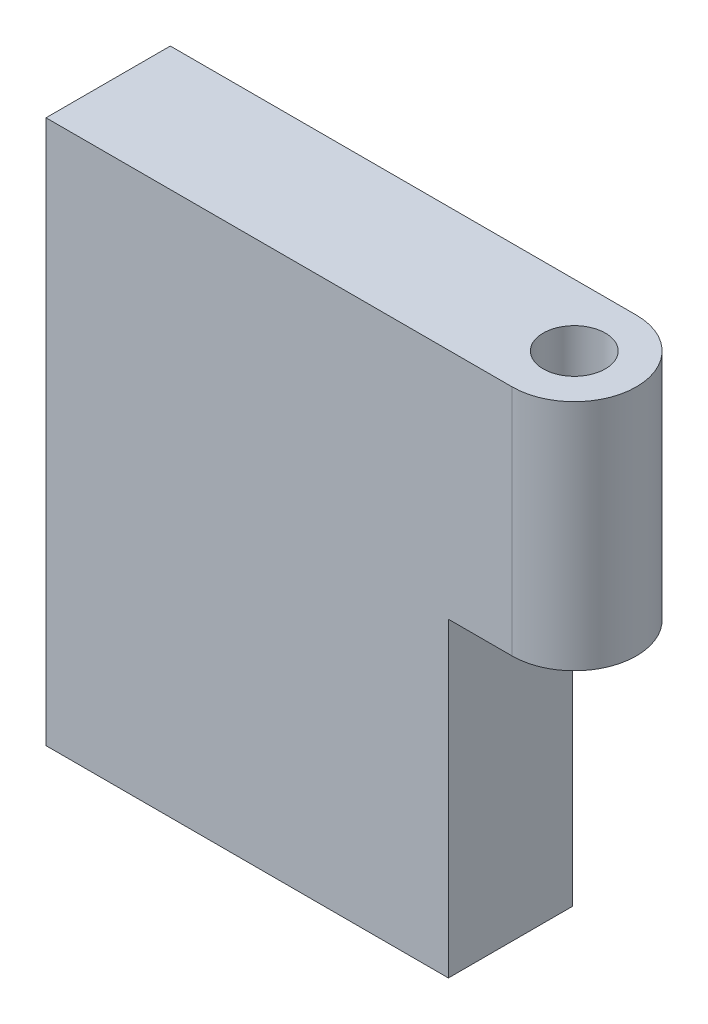
ISO-10303-21;
HEADER;
FILE_DESCRIPTION(('STEP AP214'),'2;1');
FILE_NAME('part.step','',(''),(''),'','','');
FILE_SCHEMA(('AUTOMOTIVE_DESIGN { 1 0 10303 214 1 1 1 1 }'));
ENDSEC;
DATA;
#1=APPLICATION_CONTEXT('core data for automotive mechanical design processes');
#2=APPLICATION_PROTOCOL_DEFINITION('international standard','automotive_design',2000,#1);
#3=PRODUCT_CONTEXT('',#1,'mechanical');
#4=PRODUCT('Part','Part','',(#3));
#5=PRODUCT_RELATED_PRODUCT_CATEGORY('part','',(#4));
#6=PRODUCT_DEFINITION_FORMATION('','',#4);
#7=PRODUCT_DEFINITION_CONTEXT('part definition',#1,'design');
#8=PRODUCT_DEFINITION('design','',#6,#7);
#9=PRODUCT_DEFINITION_SHAPE('','',#8);
#10=(LENGTH_UNIT() NAMED_UNIT(*) SI_UNIT(.MILLI.,.METRE.));
#11=(NAMED_UNIT(*) PLANE_ANGLE_UNIT() SI_UNIT($,.RADIAN.));
#12=(NAMED_UNIT(*) SI_UNIT($,.STERADIAN.) SOLID_ANGLE_UNIT());
#13=UNCERTAINTY_MEASURE_WITH_UNIT(LENGTH_MEASURE(1.E-05),#10,'distance_accuracy_value','');
#14=(GEOMETRIC_REPRESENTATION_CONTEXT(3) GLOBAL_UNCERTAINTY_ASSIGNED_CONTEXT((#13)) GLOBAL_UNIT_ASSIGNED_CONTEXT((#10,
#11,#12)) REPRESENTATION_CONTEXT('',''));
#15=CARTESIAN_POINT('',(0.,0.,0.));
#16=DIRECTION('',(0.,0.,1.));
#17=DIRECTION('',(1.,0.,0.));
#18=AXIS2_PLACEMENT_3D('',#15,#16,#17);
#19=CARTESIAN_POINT('',(0.,0.,0.));
#20=DIRECTION('',(0.,1.,0.));
#21=DIRECTION('',(0.,0.,1.));
#22=AXIS2_PLACEMENT_3D('',#19,#20,#21);
#23=PLANE('',#22);
#24=CARTESIAN_POINT('',(0.,0.,0.));
#25=DIRECTION('',(0.,1.,0.));
#26=DIRECTION('',(0.,0.,1.));
#27=AXIS2_PLACEMENT_3D('',#24,#25,#26);
#28=CIRCLE('',#27,2.);
#29=CARTESIAN_POINT('',(0.,0.,2.));
#30=VERTEX_POINT('',#29);
#31=EDGE_CURVE('E128',#30,#30,#28,.T.);
#32=ORIENTED_EDGE('',*,*,#31,.T.);
#33=EDGE_LOOP('',(#32));
#34=FACE_BOUND('',#33,.T.);
#35=DIRECTION('',(0.,0.,1.));
#36=VECTOR('',#35,1.);
#37=CARTESIAN_POINT('',(-4.1,0.,4.00000000000001));
#38=LINE('',#37,#36);
#39=CARTESIAN_POINT('',(-4.1,0.,-4.00000000000001));
#40=VERTEX_POINT('',#39);
#41=CARTESIAN_POINT('',(-4.1,0.,4.00000000000001));
#42=VERTEX_POINT('',#41);
#43=EDGE_CURVE('E50',#40,#42,#38,.T.);
#44=ORIENTED_EDGE('',*,*,#43,.F.);
#45=DIRECTION('',(-1.,0.,0.));
#46=VECTOR('',#45,1.);
#47=CARTESIAN_POINT('',(0.,0.,-4.00000000000001));
#48=LINE('',#47,#46);
#49=CARTESIAN_POINT('',(0.,0.,-4.00000000000001));
#50=VERTEX_POINT('',#49);
#51=EDGE_CURVE('E137',#50,#40,#48,.T.);
#52=ORIENTED_EDGE('',*,*,#51,.F.);
#53=CARTESIAN_POINT('',(0.,0.,0.));
#54=DIRECTION('',(0.,1.,0.));
#55=DIRECTION('',(0.,0.,1.));
#56=AXIS2_PLACEMENT_3D('',#53,#54,#55);
#57=CIRCLE('',#56,4.);
#58=CARTESIAN_POINT('',(0.,0.,4.00000000000001));
#59=VERTEX_POINT('',#58);
#60=EDGE_CURVE('E74',#59,#50,#57,.T.);
#61=ORIENTED_EDGE('',*,*,#60,.F.);
#62=DIRECTION('',(-1.,0.,0.));
#63=VECTOR('',#62,1.);
#64=CARTESIAN_POINT('',(0.,0.,4.00000000000001));
#65=LINE('',#64,#63);
#66=EDGE_CURVE('E131',#59,#42,#65,.T.);
#67=ORIENTED_EDGE('',*,*,#66,.T.);
#68=EDGE_LOOP('',(#44,#52,#61,#67));
#69=FACE_BOUND('',#68,.T.);
#70=ADVANCED_FACE('F35',(#34,#69),#23,.F.);
#71=CARTESIAN_POINT('',(0.,15.,4.00000000000001));
#72=DIRECTION('',(0.,0.,1.));
#73=DIRECTION('',(1.,0.,0.));
#74=AXIS2_PLACEMENT_3D('',#71,#72,#73);
#75=PLANE('',#74);
#76=ORIENTED_EDGE('',*,*,#66,.F.);
#77=DIRECTION('',(0.,-1.,0.));
#78=VECTOR('',#77,1.);
#79=CARTESIAN_POINT('',(0.,15.,4.00000000000001));
#80=LINE('',#79,#78);
#81=CARTESIAN_POINT('',(0.,15.,4.00000000000001));
#82=VERTEX_POINT('',#81);
#83=EDGE_CURVE('E11',#82,#59,#80,.T.);
#84=ORIENTED_EDGE('',*,*,#83,.F.);
#85=DIRECTION('',(-1.,0.,0.));
#86=VECTOR('',#85,1.);
#87=CARTESIAN_POINT('',(0.,15.,4.00000000000001));
#88=LINE('',#87,#86);
#89=CARTESIAN_POINT('',(-30.,15.,4.));
#90=VERTEX_POINT('',#89);
#91=EDGE_CURVE('E134',#82,#90,#88,.T.);
#92=ORIENTED_EDGE('',*,*,#91,.T.);
#93=DIRECTION('',(0.,-1.,0.));
#94=VECTOR('',#93,1.);
#95=CARTESIAN_POINT('',(-30.,15.,4.));
#96=LINE('',#95,#94);
#97=CARTESIAN_POINT('',(-30.,-20.,4.));
#98=VERTEX_POINT('',#97);
#99=EDGE_CURVE('E59',#90,#98,#96,.T.);
#100=ORIENTED_EDGE('',*,*,#99,.T.);
#101=DIRECTION('',(-1.,0.,0.));
#102=VECTOR('',#101,1.);
#103=CARTESIAN_POINT('',(-30.,-20.,4.));
#104=LINE('',#103,#102);
#105=CARTESIAN_POINT('',(-4.1,-20.,4.00000000000001));
#106=VERTEX_POINT('',#105);
#107=EDGE_CURVE('E117',#106,#98,#104,.T.);
#108=ORIENTED_EDGE('',*,*,#107,.F.);
#109=DIRECTION('',(0.,1.,0.));
#110=VECTOR('',#109,1.);
#111=CARTESIAN_POINT('',(-4.1,-20.,4.00000000000001));
#112=LINE('',#111,#110);
#113=EDGE_CURVE('E122',#106,#42,#112,.T.);
#114=ORIENTED_EDGE('',*,*,#113,.T.);
#115=EDGE_LOOP('',(#76,#84,#92,#100,#108,#114));
#116=FACE_BOUND('',#115,.T.);
#117=ADVANCED_FACE('F37',(#116),#75,.T.);
#118=CARTESIAN_POINT('',(0.,15.,0.));
#119=DIRECTION('',(0.,-1.,0.));
#120=DIRECTION('',(0.,0.,-1.));
#121=AXIS2_PLACEMENT_3D('',#118,#119,#120);
#122=CYLINDRICAL_SURFACE('',#121,4.);
#123=ORIENTED_EDGE('',*,*,#60,.T.);
#124=DIRECTION('',(0.,-1.,0.));
#125=VECTOR('',#124,1.);
#126=CARTESIAN_POINT('',(0.,15.,-4.00000000000001));
#127=LINE('',#126,#125);
#128=CARTESIAN_POINT('',(0.,15.,-4.00000000000001));
#129=VERTEX_POINT('',#128);
#130=EDGE_CURVE('E43',#129,#50,#127,.T.);
#131=ORIENTED_EDGE('',*,*,#130,.F.);
#132=CARTESIAN_POINT('',(0.,15.,0.));
#133=DIRECTION('',(0.,1.,0.));
#134=DIRECTION('',(0.,0.,1.));
#135=AXIS2_PLACEMENT_3D('',#132,#133,#134);
#136=CIRCLE('',#135,4.);
#137=EDGE_CURVE('E136',#82,#129,#136,.T.);
#138=ORIENTED_EDGE('',*,*,#137,.F.);
#139=ORIENTED_EDGE('',*,*,#83,.T.);
#140=EDGE_LOOP('',(#123,#131,#138,#139));
#141=FACE_BOUND('',#140,.T.);
#142=ADVANCED_FACE('F168',(#141),#122,.T.);
#143=CARTESIAN_POINT('',(0.,15.,-4.00000000000001));
#144=DIRECTION('',(0.,0.,1.));
#145=DIRECTION('',(1.,0.,0.));
#146=AXIS2_PLACEMENT_3D('',#143,#144,#145);
#147=PLANE('',#146);
#148=ORIENTED_EDGE('',*,*,#51,.T.);
#149=DIRECTION('',(0.,1.,0.));
#150=VECTOR('',#149,1.);
#151=CARTESIAN_POINT('',(-4.1,-20.,-4.));
#152=LINE('',#151,#150);
#153=CARTESIAN_POINT('',(-4.1,-20.,-4.));
#154=VERTEX_POINT('',#153);
#155=EDGE_CURVE('E109',#154,#40,#152,.T.);
#156=ORIENTED_EDGE('',*,*,#155,.F.);
#157=DIRECTION('',(1.,0.,0.));
#158=VECTOR('',#157,1.);
#159=CARTESIAN_POINT('',(-30.,-20.,-4.00000000000001));
#160=LINE('',#159,#158);
#161=CARTESIAN_POINT('',(-30.,-20.,-4.00000000000001));
#162=VERTEX_POINT('',#161);
#163=EDGE_CURVE('E106',#162,#154,#160,.T.);
#164=ORIENTED_EDGE('',*,*,#163,.F.);
#165=DIRECTION('',(0.,-1.,0.));
#166=VECTOR('',#165,1.);
#167=CARTESIAN_POINT('',(-30.,15.,-4.));
#168=LINE('',#167,#166);
#169=CARTESIAN_POINT('',(-30.,15.,-4.));
#170=VERTEX_POINT('',#169);
#171=EDGE_CURVE('E95',#170,#162,#168,.T.);
#172=ORIENTED_EDGE('',*,*,#171,.F.);
#173=DIRECTION('',(-1.,0.,0.));
#174=VECTOR('',#173,1.);
#175=CARTESIAN_POINT('',(0.,15.,-4.00000000000001));
#176=LINE('',#175,#174);
#177=EDGE_CURVE('E139',#129,#170,#176,.T.);
#178=ORIENTED_EDGE('',*,*,#177,.F.);
#179=ORIENTED_EDGE('',*,*,#130,.T.);
#180=EDGE_LOOP('',(#148,#156,#164,#172,#178,#179));
#181=FACE_BOUND('',#180,.T.);
#182=ADVANCED_FACE('F107',(#181),#147,.F.);
#183=CARTESIAN_POINT('',(-30.,15.,0.));
#184=DIRECTION('',(-1.,0.,0.));
#185=DIRECTION('',(0.,0.,1.));
#186=AXIS2_PLACEMENT_3D('',#183,#184,#185);
#187=PLANE('',#186);
#188=ORIENTED_EDGE('',*,*,#171,.T.);
#189=DIRECTION('',(0.,0.,-1.));
#190=VECTOR('',#189,1.);
#191=CARTESIAN_POINT('',(-30.,-20.,4.));
#192=LINE('',#191,#190);
#193=EDGE_CURVE('E99',#98,#162,#192,.T.);
#194=ORIENTED_EDGE('',*,*,#193,.F.);
#195=ORIENTED_EDGE('',*,*,#99,.F.);
#196=DIRECTION('',(0.,0.,-1.));
#197=VECTOR('',#196,1.);
#198=CARTESIAN_POINT('',(-30.,15.,0.));
#199=LINE('',#198,#197);
#200=EDGE_CURVE('E101',#90,#170,#199,.T.);
#201=ORIENTED_EDGE('',*,*,#200,.T.);
#202=EDGE_LOOP('',(#188,#194,#195,#201));
#203=FACE_BOUND('',#202,.T.);
#204=ADVANCED_FACE('F97',(#203),#187,.T.);
#205=CARTESIAN_POINT('',(0.,15.,0.));
#206=DIRECTION('',(0.,1.,0.));
#207=DIRECTION('',(0.,0.,1.));
#208=AXIS2_PLACEMENT_3D('',#205,#206,#207);
#209=PLANE('',#208);
#210=CARTESIAN_POINT('',(0.,15.,0.));
#211=DIRECTION('',(0.,1.,0.));
#212=DIRECTION('',(0.,0.,1.));
#213=AXIS2_PLACEMENT_3D('',#210,#211,#212);
#214=CIRCLE('',#213,2.);
#215=CARTESIAN_POINT('',(0.,15.,2.));
#216=VERTEX_POINT('',#215);
#217=EDGE_CURVE('E127',#216,#216,#214,.T.);
#218=ORIENTED_EDGE('',*,*,#217,.F.);
#219=EDGE_LOOP('',(#218));
#220=FACE_BOUND('',#219,.T.);
#221=ORIENTED_EDGE('',*,*,#91,.F.);
#222=ORIENTED_EDGE('',*,*,#137,.T.);
#223=ORIENTED_EDGE('',*,*,#177,.T.);
#224=ORIENTED_EDGE('',*,*,#200,.F.);
#225=EDGE_LOOP('',(#221,#222,#223,#224));
#226=FACE_BOUND('',#225,.T.);
#227=ADVANCED_FACE('F157',(#220,#226),#209,.T.);
#228=CARTESIAN_POINT('',(0.,0.,0.));
#229=DIRECTION('',(0.,1.,0.));
#230=DIRECTION('',(0.,0.,1.));
#231=AXIS2_PLACEMENT_3D('',#228,#229,#230);
#232=CYLINDRICAL_SURFACE('',#231,2.);
#233=ORIENTED_EDGE('',*,*,#31,.F.);
#234=EDGE_LOOP('',(#233));
#235=FACE_BOUND('',#234,.T.);
#236=ORIENTED_EDGE('',*,*,#217,.T.);
#237=EDGE_LOOP('',(#236));
#238=FACE_BOUND('',#237,.T.);
#239=ADVANCED_FACE('F149',(#235,#238),#232,.F.);
#240=CARTESIAN_POINT('',(-4.1,-20.,4.00000000000001));
#241=DIRECTION('',(-1.,0.,0.));
#242=DIRECTION('',(0.,0.,1.));
#243=AXIS2_PLACEMENT_3D('',#240,#241,#242);
#244=PLANE('',#243);
#245=ORIENTED_EDGE('',*,*,#43,.T.);
#246=ORIENTED_EDGE('',*,*,#113,.F.);
#247=DIRECTION('',(0.,0.,1.));
#248=VECTOR('',#247,1.);
#249=CARTESIAN_POINT('',(-4.1,-20.,4.00000000000001));
#250=LINE('',#249,#248);
#251=EDGE_CURVE('E112',#154,#106,#250,.T.);
#252=ORIENTED_EDGE('',*,*,#251,.F.);
#253=ORIENTED_EDGE('',*,*,#155,.T.);
#254=EDGE_LOOP('',(#245,#246,#252,#253));
#255=FACE_BOUND('',#254,.T.);
#256=ADVANCED_FACE('F147',(#255),#244,.F.);
#257=CARTESIAN_POINT('',(0.,-20.,0.));
#258=DIRECTION('',(0.,-1.,0.));
#259=DIRECTION('',(0.,0.,-1.));
#260=AXIS2_PLACEMENT_3D('',#257,#258,#259);
#261=PLANE('',#260);
#262=ORIENTED_EDGE('',*,*,#193,.T.);
#263=ORIENTED_EDGE('',*,*,#163,.T.);
#264=ORIENTED_EDGE('',*,*,#251,.T.);
#265=ORIENTED_EDGE('',*,*,#107,.T.);
#266=EDGE_LOOP('',(#262,#263,#264,#265));
#267=FACE_BOUND('',#266,.T.);
#268=ADVANCED_FACE('F115',(#267),#261,.T.);
#269=CLOSED_SHELL('',(#70,#117,#142,#182,#204,#227,#239,#256,#268));
#270=MANIFOLD_SOLID_BREP('B2',#269);
#271=ADVANCED_BREP_SHAPE_REPRESENTATION('',(#18,#270),#14);
#272=SHAPE_DEFINITION_REPRESENTATION(#9,#271);
ENDSEC;
END-ISO-10303-21;
